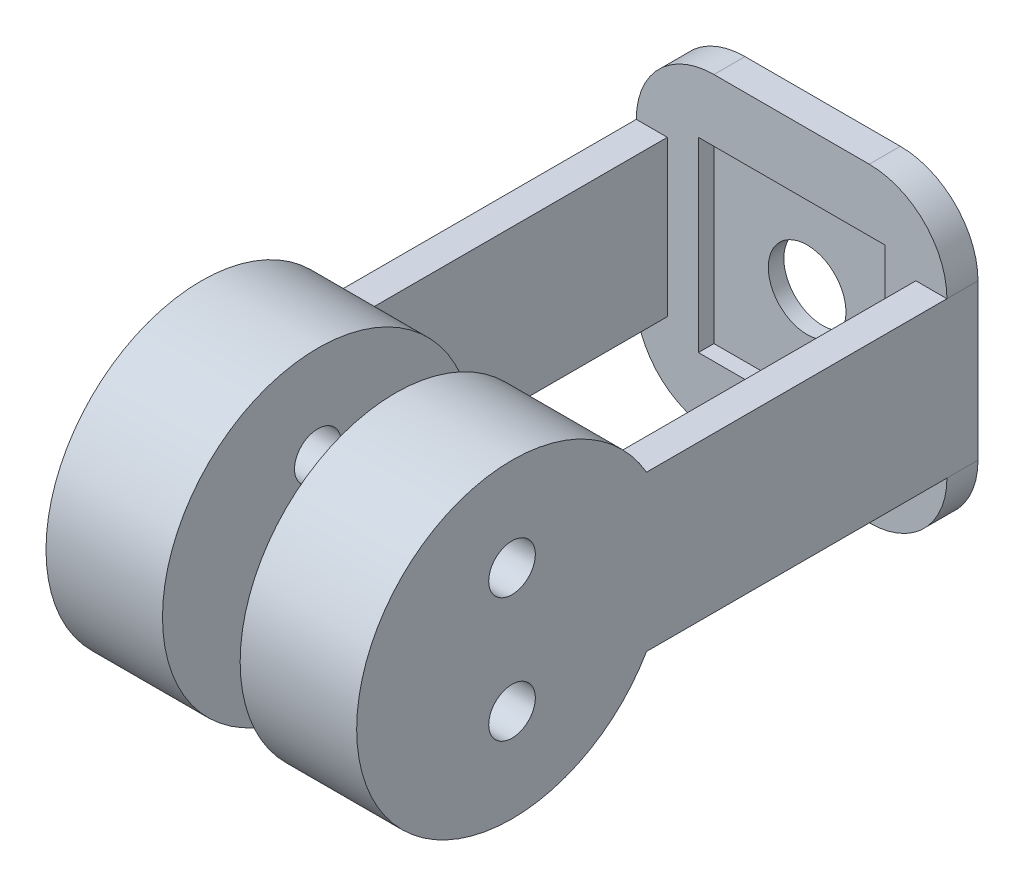
ISO-10303-21;
HEADER;
FILE_DESCRIPTION(('STEP AP214'),'2;1');
FILE_NAME('part.step','',(''),(''),'','','');
FILE_SCHEMA(('AUTOMOTIVE_DESIGN { 1 0 10303 214 1 1 1 1 }'));
ENDSEC;
DATA;
#1=APPLICATION_CONTEXT('core data for automotive mechanical design processes');
#2=APPLICATION_PROTOCOL_DEFINITION('international standard','automotive_design',2000,#1);
#3=PRODUCT_CONTEXT('',#1,'mechanical');
#4=PRODUCT('Part','Part','',(#3));
#5=PRODUCT_RELATED_PRODUCT_CATEGORY('part','',(#4));
#6=PRODUCT_DEFINITION_FORMATION('','',#4);
#7=PRODUCT_DEFINITION_CONTEXT('part definition',#1,'design');
#8=PRODUCT_DEFINITION('design','',#6,#7);
#9=PRODUCT_DEFINITION_SHAPE('','',#8);
#10=(LENGTH_UNIT() NAMED_UNIT(*) SI_UNIT(.MILLI.,.METRE.));
#11=(NAMED_UNIT(*) PLANE_ANGLE_UNIT() SI_UNIT($,.RADIAN.));
#12=(NAMED_UNIT(*) SI_UNIT($,.STERADIAN.) SOLID_ANGLE_UNIT());
#13=UNCERTAINTY_MEASURE_WITH_UNIT(LENGTH_MEASURE(1.E-05),#10,'distance_accuracy_value','');
#14=(GEOMETRIC_REPRESENTATION_CONTEXT(3) GLOBAL_UNCERTAINTY_ASSIGNED_CONTEXT((#13)) GLOBAL_UNIT_ASSIGNED_CONTEXT((#10,
#11,#12)) REPRESENTATION_CONTEXT('',''));
#15=CARTESIAN_POINT('',(0.,0.,0.));
#16=DIRECTION('',(0.,0.,1.));
#17=DIRECTION('',(1.,0.,0.));
#18=AXIS2_PLACEMENT_3D('',#15,#16,#17);
#19=CARTESIAN_POINT('',(-5.,-5.,2.));
#20=DIRECTION('',(0.,0.,-1.));
#21=DIRECTION('',(-1.,0.,0.));
#22=AXIS2_PLACEMENT_3D('',#19,#20,#21);
#23=CYLINDRICAL_SURFACE('',#22,5.);
#24=DIRECTION('',(0.,0.,-1.));
#25=VECTOR('',#24,1.);
#26=CARTESIAN_POINT('',(-5.,-10.,2.));
#27=LINE('',#26,#25);
#28=CARTESIAN_POINT('',(-5.,-10.,2.));
#29=VERTEX_POINT('',#28);
#30=CARTESIAN_POINT('',(-5.,-10.,0.));
#31=VERTEX_POINT('',#30);
#32=EDGE_CURVE('E180',#29,#31,#27,.T.);
#33=ORIENTED_EDGE('',*,*,#32,.F.);
#34=CARTESIAN_POINT('',(-5.,-5.,2.));
#35=DIRECTION('',(0.,0.,1.));
#36=DIRECTION('',(1.,0.,0.));
#37=AXIS2_PLACEMENT_3D('',#34,#35,#36);
#38=CIRCLE('',#37,5.);
#39=CARTESIAN_POINT('',(-10.,-5.,2.));
#40=VERTEX_POINT('',#39);
#41=EDGE_CURVE('E63',#40,#29,#38,.T.);
#42=ORIENTED_EDGE('',*,*,#41,.F.);
#43=DIRECTION('',(0.,0.,-1.));
#44=VECTOR('',#43,1.);
#45=CARTESIAN_POINT('',(-10.,-5.,2.));
#46=LINE('',#45,#44);
#47=CARTESIAN_POINT('',(-10.,-5.,0.));
#48=VERTEX_POINT('',#47);
#49=EDGE_CURVE('E177',#48,#40,#46,.F.);
#50=ORIENTED_EDGE('',*,*,#49,.F.);
#51=CARTESIAN_POINT('',(-5.,-5.,0.));
#52=DIRECTION('',(0.,0.,1.));
#53=DIRECTION('',(1.,0.,0.));
#54=AXIS2_PLACEMENT_3D('',#51,#52,#53);
#55=CIRCLE('',#54,5.);
#56=EDGE_CURVE('E12',#31,#48,#55,.F.);
#57=ORIENTED_EDGE('',*,*,#56,.F.);
#58=EDGE_LOOP('',(#33,#42,#50,#57));
#59=FACE_BOUND('',#58,.T.);
#60=ADVANCED_FACE('F56',(#59),#23,.T.);
#61=CARTESIAN_POINT('',(5.,-5.,2.));
#62=DIRECTION('',(0.,0.,-1.));
#63=DIRECTION('',(-1.,0.,0.));
#64=AXIS2_PLACEMENT_3D('',#61,#62,#63);
#65=CYLINDRICAL_SURFACE('',#64,5.);
#66=DIRECTION('',(0.,0.,-1.));
#67=VECTOR('',#66,1.);
#68=CARTESIAN_POINT('',(10.,-5.,2.));
#69=LINE('',#68,#67);
#70=CARTESIAN_POINT('',(10.,-5.,2.));
#71=VERTEX_POINT('',#70);
#72=CARTESIAN_POINT('',(10.,-5.,0.));
#73=VERTEX_POINT('',#72);
#74=EDGE_CURVE('E347',#71,#73,#69,.T.);
#75=ORIENTED_EDGE('',*,*,#74,.F.);
#76=CARTESIAN_POINT('',(5.,-5.,2.));
#77=DIRECTION('',(0.,0.,1.));
#78=DIRECTION('',(1.,0.,0.));
#79=AXIS2_PLACEMENT_3D('',#76,#77,#78);
#80=CIRCLE('',#79,5.);
#81=CARTESIAN_POINT('',(5.,-10.,2.));
#82=VERTEX_POINT('',#81);
#83=EDGE_CURVE('E353',#82,#71,#80,.T.);
#84=ORIENTED_EDGE('',*,*,#83,.F.);
#85=DIRECTION('',(0.,0.,-1.));
#86=VECTOR('',#85,1.);
#87=CARTESIAN_POINT('',(5.,-10.,2.));
#88=LINE('',#87,#86);
#89=CARTESIAN_POINT('',(5.,-10.,0.));
#90=VERTEX_POINT('',#89);
#91=EDGE_CURVE('E350',#90,#82,#88,.F.);
#92=ORIENTED_EDGE('',*,*,#91,.F.);
#93=CARTESIAN_POINT('',(5.,-5.,0.));
#94=DIRECTION('',(0.,0.,1.));
#95=DIRECTION('',(1.,0.,0.));
#96=AXIS2_PLACEMENT_3D('',#93,#94,#95);
#97=CIRCLE('',#96,5.);
#98=EDGE_CURVE('E355',#73,#90,#97,.F.);
#99=ORIENTED_EDGE('',*,*,#98,.F.);
#100=EDGE_LOOP('',(#75,#84,#92,#99));
#101=FACE_BOUND('',#100,.T.);
#102=ADVANCED_FACE('F366',(#101),#65,.T.);
#103=CARTESIAN_POINT('',(5.,5.,2.));
#104=DIRECTION('',(0.,0.,1.));
#105=DIRECTION('',(1.,0.,0.));
#106=AXIS2_PLACEMENT_3D('',#103,#104,#105);
#107=CYLINDRICAL_SURFACE('',#106,5.);
#108=DIRECTION('',(0.,0.,1.));
#109=VECTOR('',#108,1.);
#110=CARTESIAN_POINT('',(10.,5.,2.));
#111=LINE('',#110,#109);
#112=CARTESIAN_POINT('',(10.,5.,0.));
#113=VERTEX_POINT('',#112);
#114=CARTESIAN_POINT('',(10.,5.,2.));
#115=VERTEX_POINT('',#114);
#116=EDGE_CURVE('E336',#113,#115,#111,.T.);
#117=ORIENTED_EDGE('',*,*,#116,.F.);
#118=CARTESIAN_POINT('',(5.,5.,0.));
#119=DIRECTION('',(0.,0.,1.));
#120=DIRECTION('',(1.,0.,0.));
#121=AXIS2_PLACEMENT_3D('',#118,#119,#120);
#122=CIRCLE('',#121,5.);
#123=CARTESIAN_POINT('',(5.,10.,0.));
#124=VERTEX_POINT('',#123);
#125=EDGE_CURVE('E342',#124,#113,#122,.F.);
#126=ORIENTED_EDGE('',*,*,#125,.F.);
#127=DIRECTION('',(0.,0.,1.));
#128=VECTOR('',#127,1.);
#129=CARTESIAN_POINT('',(5.,10.,2.));
#130=LINE('',#129,#128);
#131=CARTESIAN_POINT('',(5.,10.,2.));
#132=VERTEX_POINT('',#131);
#133=EDGE_CURVE('E339',#132,#124,#130,.F.);
#134=ORIENTED_EDGE('',*,*,#133,.F.);
#135=CARTESIAN_POINT('',(5.,5.,2.));
#136=DIRECTION('',(0.,0.,1.));
#137=DIRECTION('',(1.,0.,0.));
#138=AXIS2_PLACEMENT_3D('',#135,#136,#137);
#139=CIRCLE('',#138,5.);
#140=EDGE_CURVE('E345',#115,#132,#139,.T.);
#141=ORIENTED_EDGE('',*,*,#140,.F.);
#142=EDGE_LOOP('',(#117,#126,#134,#141));
#143=FACE_BOUND('',#142,.T.);
#144=ADVANCED_FACE('F392',(#143),#107,.T.);
#145=CARTESIAN_POINT('',(-5.,5.,2.));
#146=DIRECTION('',(0.,0.,-1.));
#147=DIRECTION('',(-1.,0.,0.));
#148=AXIS2_PLACEMENT_3D('',#145,#146,#147);
#149=CYLINDRICAL_SURFACE('',#148,5.);
#150=DIRECTION('',(0.,0.,-1.));
#151=VECTOR('',#150,1.);
#152=CARTESIAN_POINT('',(-10.,5.,2.));
#153=LINE('',#152,#151);
#154=CARTESIAN_POINT('',(-10.,5.,2.));
#155=VERTEX_POINT('',#154);
#156=CARTESIAN_POINT('',(-10.,5.,0.));
#157=VERTEX_POINT('',#156);
#158=EDGE_CURVE('E315',#155,#157,#153,.T.);
#159=ORIENTED_EDGE('',*,*,#158,.F.);
#160=CARTESIAN_POINT('',(-5.,5.,2.));
#161=DIRECTION('',(0.,0.,1.));
#162=DIRECTION('',(1.,0.,0.));
#163=AXIS2_PLACEMENT_3D('',#160,#161,#162);
#164=CIRCLE('',#163,5.);
#165=CARTESIAN_POINT('',(-5.,10.,2.));
#166=VERTEX_POINT('',#165);
#167=EDGE_CURVE('E331',#166,#155,#164,.T.);
#168=ORIENTED_EDGE('',*,*,#167,.F.);
#169=DIRECTION('',(0.,0.,-1.));
#170=VECTOR('',#169,1.);
#171=CARTESIAN_POINT('',(-5.,10.,2.));
#172=LINE('',#171,#170);
#173=CARTESIAN_POINT('',(-5.,10.,0.));
#174=VERTEX_POINT('',#173);
#175=EDGE_CURVE('E328',#174,#166,#172,.F.);
#176=ORIENTED_EDGE('',*,*,#175,.F.);
#177=CARTESIAN_POINT('',(-5.,5.,0.));
#178=DIRECTION('',(0.,0.,1.));
#179=DIRECTION('',(1.,0.,0.));
#180=AXIS2_PLACEMENT_3D('',#177,#178,#179);
#181=CIRCLE('',#180,5.);
#182=EDGE_CURVE('E333',#157,#174,#181,.F.);
#183=ORIENTED_EDGE('',*,*,#182,.F.);
#184=EDGE_LOOP('',(#159,#168,#176,#183));
#185=FACE_BOUND('',#184,.T.);
#186=ADVANCED_FACE('F399',(#185),#149,.T.);
#187=CARTESIAN_POINT('',(10.,10.,2.));
#188=DIRECTION('',(-1.,0.,0.));
#189=DIRECTION('',(0.,0.,1.));
#190=AXIS2_PLACEMENT_3D('',#187,#188,#189);
#191=PLANE('',#190);
#192=CARTESIAN_POINT('',(10.,4.,30.));
#193=DIRECTION('',(-1.,0.,0.));
#194=DIRECTION('',(0.,0.,1.));
#195=AXIS2_PLACEMENT_3D('',#192,#193,#194);
#196=CIRCLE('',#195,1.5);
#197=CARTESIAN_POINT('',(10.,4.,31.5));
#198=VERTEX_POINT('',#197);
#199=EDGE_CURVE('E234',#198,#198,#196,.T.);
#200=ORIENTED_EDGE('',*,*,#199,.T.);
#201=EDGE_LOOP('',(#200));
#202=FACE_BOUND('',#201,.T.);
#203=CARTESIAN_POINT('',(10.,-4.,30.));
#204=DIRECTION('',(-1.,0.,0.));
#205=DIRECTION('',(0.,0.,1.));
#206=AXIS2_PLACEMENT_3D('',#203,#204,#205);
#207=CIRCLE('',#206,1.5);
#208=CARTESIAN_POINT('',(10.,-4.,31.5));
#209=VERTEX_POINT('',#208);
#210=EDGE_CURVE('E241',#209,#209,#207,.T.);
#211=ORIENTED_EDGE('',*,*,#210,.T.);
#212=EDGE_LOOP('',(#211));
#213=FACE_BOUND('',#212,.T.);
#214=DIRECTION('',(0.,0.,1.));
#215=VECTOR('',#214,1.);
#216=CARTESIAN_POINT('',(10.,-5.,0.));
#217=LINE('',#216,#215);
#218=CARTESIAN_POINT('',(10.,-5.,21.3397459621556));
#219=VERTEX_POINT('',#218);
#220=EDGE_CURVE('E205',#71,#219,#217,.T.);
#221=ORIENTED_EDGE('',*,*,#220,.F.);
#222=ORIENTED_EDGE('',*,*,#74,.T.);
#223=DIRECTION('',(0.,1.,0.));
#224=VECTOR('',#223,1.);
#225=CARTESIAN_POINT('',(10.,10.,0.));
#226=LINE('',#225,#224);
#227=EDGE_CURVE('E309',#73,#113,#226,.T.);
#228=ORIENTED_EDGE('',*,*,#227,.T.);
#229=ORIENTED_EDGE('',*,*,#116,.T.);
#230=DIRECTION('',(0.,0.,1.));
#231=VECTOR('',#230,1.);
#232=CARTESIAN_POINT('',(10.,5.,0.));
#233=LINE('',#232,#231);
#234=CARTESIAN_POINT('',(10.,5.,21.3397459621556));
#235=VERTEX_POINT('',#234);
#236=EDGE_CURVE('E218',#115,#235,#233,.T.);
#237=ORIENTED_EDGE('',*,*,#236,.T.);
#238=CARTESIAN_POINT('',(10.,0.,30.));
#239=DIRECTION('',(-1.,0.,0.));
#240=DIRECTION('',(0.,0.,1.));
#241=AXIS2_PLACEMENT_3D('',#238,#239,#240);
#242=CIRCLE('',#241,10.);
#243=EDGE_CURVE('E266',#219,#235,#242,.T.);
#244=ORIENTED_EDGE('',*,*,#243,.F.);
#245=EDGE_LOOP('',(#221,#222,#228,#229,#237,#244));
#246=FACE_BOUND('',#245,.T.);
#247=ADVANCED_FACE('F386',(#202,#213,#246),#191,.F.);
#248=CARTESIAN_POINT('',(-10.,10.,2.));
#249=DIRECTION('',(1.,0.,0.));
#250=DIRECTION('',(0.,0.,-1.));
#251=AXIS2_PLACEMENT_3D('',#248,#249,#250);
#252=PLANE('',#251);
#253=CARTESIAN_POINT('',(-10.,4.,30.));
#254=DIRECTION('',(-1.,0.,0.));
#255=DIRECTION('',(0.,0.,1.));
#256=AXIS2_PLACEMENT_3D('',#253,#254,#255);
#257=CIRCLE('',#256,1.5);
#258=CARTESIAN_POINT('',(-10.,4.,31.5));
#259=VERTEX_POINT('',#258);
#260=EDGE_CURVE('E238',#259,#259,#257,.T.);
#261=ORIENTED_EDGE('',*,*,#260,.F.);
#262=EDGE_LOOP('',(#261));
#263=FACE_BOUND('',#262,.T.);
#264=CARTESIAN_POINT('',(-10.,-4.,30.));
#265=DIRECTION('',(-1.,0.,0.));
#266=DIRECTION('',(0.,0.,1.));
#267=AXIS2_PLACEMENT_3D('',#264,#265,#266);
#268=CIRCLE('',#267,1.5);
#269=CARTESIAN_POINT('',(-10.,-4.,31.5));
#270=VERTEX_POINT('',#269);
#271=EDGE_CURVE('E233',#270,#270,#268,.T.);
#272=ORIENTED_EDGE('',*,*,#271,.F.);
#273=EDGE_LOOP('',(#272));
#274=FACE_BOUND('',#273,.T.);
#275=DIRECTION('',(0.,-1.,0.));
#276=VECTOR('',#275,1.);
#277=CARTESIAN_POINT('',(-10.,10.,0.));
#278=LINE('',#277,#276);
#279=EDGE_CURVE('E188',#157,#48,#278,.T.);
#280=ORIENTED_EDGE('',*,*,#279,.T.);
#281=ORIENTED_EDGE('',*,*,#49,.T.);
#282=DIRECTION('',(0.,0.,1.));
#283=VECTOR('',#282,1.);
#284=CARTESIAN_POINT('',(-10.,-5.,0.));
#285=LINE('',#284,#283);
#286=CARTESIAN_POINT('',(-10.,-5.,21.3397459621556));
#287=VERTEX_POINT('',#286);
#288=EDGE_CURVE('E186',#40,#287,#285,.T.);
#289=ORIENTED_EDGE('',*,*,#288,.T.);
#290=CARTESIAN_POINT('',(-10.,0.,30.));
#291=DIRECTION('',(-1.,0.,0.));
#292=DIRECTION('',(0.,0.,1.));
#293=AXIS2_PLACEMENT_3D('',#290,#291,#292);
#294=CIRCLE('',#293,10.);
#295=CARTESIAN_POINT('',(-10.,5.,21.3397459621556));
#296=VERTEX_POINT('',#295);
#297=EDGE_CURVE('E265',#287,#296,#294,.T.);
#298=ORIENTED_EDGE('',*,*,#297,.T.);
#299=DIRECTION('',(0.,0.,1.));
#300=VECTOR('',#299,1.);
#301=CARTESIAN_POINT('',(-10.,5.,0.));
#302=LINE('',#301,#300);
#303=EDGE_CURVE('E214',#155,#296,#302,.T.);
#304=ORIENTED_EDGE('',*,*,#303,.F.);
#305=ORIENTED_EDGE('',*,*,#158,.T.);
#306=EDGE_LOOP('',(#280,#281,#289,#298,#304,#305));
#307=FACE_BOUND('',#306,.T.);
#308=ADVANCED_FACE('F184',(#263,#274,#307),#252,.F.);
#309=CARTESIAN_POINT('',(8.,10.,40.));
#310=DIRECTION('',(1.,0.,0.));
#311=DIRECTION('',(0.,1.,0.));
#312=AXIS2_PLACEMENT_3D('',#309,#310,#311);
#313=PLANE('',#312);
#314=DIRECTION('',(0.,-1.,0.));
#315=VECTOR('',#314,1.);
#316=CARTESIAN_POINT('',(8.,10.,2.));
#317=LINE('',#316,#315);
#318=CARTESIAN_POINT('',(8.,5.,2.));
#319=VERTEX_POINT('',#318);
#320=CARTESIAN_POINT('',(8.,-5.,2.));
#321=VERTEX_POINT('',#320);
#322=EDGE_CURVE('E270',#319,#321,#317,.T.);
#323=ORIENTED_EDGE('',*,*,#322,.T.);
#324=DIRECTION('',(0.,0.,1.));
#325=VECTOR('',#324,1.);
#326=CARTESIAN_POINT('',(8.,-5.,40.));
#327=LINE('',#326,#325);
#328=CARTESIAN_POINT('',(8.,-5.,21.3397459621556));
#329=VERTEX_POINT('',#328);
#330=EDGE_CURVE('E230',#321,#329,#327,.T.);
#331=ORIENTED_EDGE('',*,*,#330,.T.);
#332=CARTESIAN_POINT('',(8.,0.,29.9999999999999));
#333=DIRECTION('',(1.,0.,0.));
#334=DIRECTION('',(0.,1.,0.));
#335=AXIS2_PLACEMENT_3D('',#332,#333,#334);
#336=CIRCLE('',#335,10.);
#337=CARTESIAN_POINT('',(8.,5.,21.3397459621556));
#338=VERTEX_POINT('',#337);
#339=EDGE_CURVE('E256',#329,#338,#336,.T.);
#340=ORIENTED_EDGE('',*,*,#339,.T.);
#341=DIRECTION('',(0.,0.,1.));
#342=VECTOR('',#341,1.);
#343=CARTESIAN_POINT('',(8.,5.,40.));
#344=LINE('',#343,#342);
#345=EDGE_CURVE('E226',#319,#338,#344,.T.);
#346=ORIENTED_EDGE('',*,*,#345,.F.);
#347=EDGE_LOOP('',(#323,#331,#340,#346));
#348=FACE_BOUND('',#347,.T.);
#349=ADVANCED_FACE('F374',(#348),#313,.F.);
#350=CARTESIAN_POINT('',(-8.,10.,40.));
#351=DIRECTION('',(-1.,0.,0.));
#352=DIRECTION('',(0.,-1.,0.));
#353=AXIS2_PLACEMENT_3D('',#350,#351,#352);
#354=PLANE('',#353);
#355=CARTESIAN_POINT('',(-8.,0.,30.));
#356=DIRECTION('',(-1.,0.,0.));
#357=DIRECTION('',(0.,-1.,0.));
#358=AXIS2_PLACEMENT_3D('',#355,#356,#357);
#359=CIRCLE('',#358,10.);
#360=CARTESIAN_POINT('',(-8.,5.,21.3397459621556));
#361=VERTEX_POINT('',#360);
#362=CARTESIAN_POINT('',(-8.,-5.,21.3397459621556));
#363=VERTEX_POINT('',#362);
#364=EDGE_CURVE('E262',#361,#363,#359,.T.);
#365=ORIENTED_EDGE('',*,*,#364,.T.);
#366=DIRECTION('',(0.,0.,-1.));
#367=VECTOR('',#366,1.);
#368=CARTESIAN_POINT('',(-8.,-5.,40.));
#369=LINE('',#368,#367);
#370=CARTESIAN_POINT('',(-8.,-5.,2.));
#371=VERTEX_POINT('',#370);
#372=EDGE_CURVE('E228',#363,#371,#369,.T.);
#373=ORIENTED_EDGE('',*,*,#372,.T.);
#374=DIRECTION('',(0.,1.,0.));
#375=VECTOR('',#374,1.);
#376=CARTESIAN_POINT('',(-8.,10.,2.));
#377=LINE('',#376,#375);
#378=CARTESIAN_POINT('',(-8.,5.,2.));
#379=VERTEX_POINT('',#378);
#380=EDGE_CURVE('E195',#371,#379,#377,.T.);
#381=ORIENTED_EDGE('',*,*,#380,.T.);
#382=DIRECTION('',(0.,0.,-1.));
#383=VECTOR('',#382,1.);
#384=CARTESIAN_POINT('',(-8.,5.,40.));
#385=LINE('',#384,#383);
#386=EDGE_CURVE('E212',#361,#379,#385,.T.);
#387=ORIENTED_EDGE('',*,*,#386,.F.);
#388=EDGE_LOOP('',(#365,#373,#381,#387));
#389=FACE_BOUND('',#388,.T.);
#390=ADVANCED_FACE('F405',(#389),#354,.F.);
#391=CARTESIAN_POINT('',(-10.,10.,2.));
#392=DIRECTION('',(0.,-1.,0.));
#393=DIRECTION('',(0.,0.,-1.));
#394=AXIS2_PLACEMENT_3D('',#391,#392,#393);
#395=PLANE('',#394);
#396=DIRECTION('',(-1.,0.,0.));
#397=VECTOR('',#396,1.);
#398=CARTESIAN_POINT('',(-10.,10.,2.));
#399=LINE('',#398,#397);
#400=EDGE_CURVE('E310',#132,#166,#399,.T.);
#401=ORIENTED_EDGE('',*,*,#400,.F.);
#402=ORIENTED_EDGE('',*,*,#133,.T.);
#403=DIRECTION('',(-1.,0.,0.));
#404=VECTOR('',#403,1.);
#405=CARTESIAN_POINT('',(-10.,10.,0.));
#406=LINE('',#405,#404);
#407=EDGE_CURVE('E317',#124,#174,#406,.T.);
#408=ORIENTED_EDGE('',*,*,#407,.T.);
#409=ORIENTED_EDGE('',*,*,#175,.T.);
#410=EDGE_LOOP('',(#401,#402,#408,#409));
#411=FACE_BOUND('',#410,.T.);
#412=ADVANCED_FACE('F395',(#411),#395,.F.);
#413=CARTESIAN_POINT('',(0.,0.,2.));
#414=DIRECTION('',(0.,0.,1.));
#415=DIRECTION('',(1.,0.,0.));
#416=AXIS2_PLACEMENT_3D('',#413,#414,#415);
#417=PLANE('',#416);
#418=DIRECTION('',(-1.,0.,0.));
#419=VECTOR('',#418,1.);
#420=CARTESIAN_POINT('',(-6.,6.,2.));
#421=LINE('',#420,#419);
#422=CARTESIAN_POINT('',(6.,6.,2.));
#423=VERTEX_POINT('',#422);
#424=CARTESIAN_POINT('',(-6.,6.,2.));
#425=VERTEX_POINT('',#424);
#426=EDGE_CURVE('E289',#423,#425,#421,.T.);
#427=ORIENTED_EDGE('',*,*,#426,.F.);
#428=DIRECTION('',(0.,1.,0.));
#429=VECTOR('',#428,1.);
#430=CARTESIAN_POINT('',(6.,6.,2.));
#431=LINE('',#430,#429);
#432=CARTESIAN_POINT('',(6.,-6.,2.));
#433=VERTEX_POINT('',#432);
#434=EDGE_CURVE('E273',#433,#423,#431,.T.);
#435=ORIENTED_EDGE('',*,*,#434,.F.);
#436=DIRECTION('',(1.,0.,0.));
#437=VECTOR('',#436,1.);
#438=CARTESIAN_POINT('',(-6.,-6.,2.));
#439=LINE('',#438,#437);
#440=CARTESIAN_POINT('',(-6.,-6.,2.));
#441=VERTEX_POINT('',#440);
#442=EDGE_CURVE('E278',#441,#433,#439,.T.);
#443=ORIENTED_EDGE('',*,*,#442,.F.);
#444=DIRECTION('',(0.,-1.,0.));
#445=VECTOR('',#444,1.);
#446=CARTESIAN_POINT('',(-6.,6.,2.));
#447=LINE('',#446,#445);
#448=EDGE_CURVE('E292',#425,#441,#447,.T.);
#449=ORIENTED_EDGE('',*,*,#448,.F.);
#450=EDGE_LOOP('',(#427,#435,#443,#449));
#451=FACE_BOUND('',#450,.T.);
#452=DIRECTION('',(1.,0.,0.));
#453=VECTOR('',#452,1.);
#454=CARTESIAN_POINT('',(-10.,-5.,2.));
#455=LINE('',#454,#453);
#456=EDGE_CURVE('E191',#40,#371,#455,.T.);
#457=ORIENTED_EDGE('',*,*,#456,.F.);
#458=ORIENTED_EDGE('',*,*,#41,.T.);
#459=DIRECTION('',(1.,0.,0.));
#460=VECTOR('',#459,1.);
#461=CARTESIAN_POINT('',(-10.,-10.,2.));
#462=LINE('',#461,#460);
#463=EDGE_CURVE('E312',#29,#82,#462,.T.);
#464=ORIENTED_EDGE('',*,*,#463,.T.);
#465=ORIENTED_EDGE('',*,*,#83,.T.);
#466=EDGE_CURVE('E199',#321,#71,#455,.T.);
#467=ORIENTED_EDGE('',*,*,#466,.F.);
#468=ORIENTED_EDGE('',*,*,#322,.F.);
#469=DIRECTION('',(1.,0.,0.));
#470=VECTOR('',#469,1.);
#471=CARTESIAN_POINT('',(-10.,5.,2.));
#472=LINE('',#471,#470);
#473=EDGE_CURVE('E222',#319,#115,#472,.T.);
#474=ORIENTED_EDGE('',*,*,#473,.T.);
#475=ORIENTED_EDGE('',*,*,#140,.T.);
#476=ORIENTED_EDGE('',*,*,#400,.T.);
#477=ORIENTED_EDGE('',*,*,#167,.T.);
#478=EDGE_CURVE('E209',#155,#379,#472,.T.);
#479=ORIENTED_EDGE('',*,*,#478,.T.);
#480=ORIENTED_EDGE('',*,*,#380,.F.);
#481=EDGE_LOOP('',(#457,#458,#464,#465,#467,#468,#474,#475,#476,#477,#479,#480));
#482=FACE_BOUND('',#481,.T.);
#483=ADVANCED_FACE('F192',(#451,#482),#417,.T.);
#484=CARTESIAN_POINT('',(0.,0.,2.));
#485=DIRECTION('',(0.,0.,-1.));
#486=DIRECTION('',(-1.,0.,0.));
#487=AXIS2_PLACEMENT_3D('',#484,#485,#486);
#488=CYLINDRICAL_SURFACE('',#487,2.5);
#489=CARTESIAN_POINT('',(0.,0.,0.));
#490=DIRECTION('',(0.,0.,-1.));
#491=DIRECTION('',(-1.,0.,0.));
#492=AXIS2_PLACEMENT_3D('',#489,#490,#491);
#493=CIRCLE('',#492,2.5);
#494=CARTESIAN_POINT('',(-2.5,0.,0.));
#495=VERTEX_POINT('',#494);
#496=EDGE_CURVE('E306',#495,#495,#493,.T.);
#497=ORIENTED_EDGE('',*,*,#496,.T.);
#498=EDGE_LOOP('',(#497));
#499=FACE_BOUND('',#498,.T.);
#500=CARTESIAN_POINT('',(0.,0.,1.));
#501=DIRECTION('',(0.,0.,1.));
#502=DIRECTION('',(1.,0.,0.));
#503=AXIS2_PLACEMENT_3D('',#500,#501,#502);
#504=CIRCLE('',#503,2.5);
#505=CARTESIAN_POINT('',(2.5,0.,1.));
#506=VERTEX_POINT('',#505);
#507=EDGE_CURVE('E298',#506,#506,#504,.F.);
#508=ORIENTED_EDGE('',*,*,#507,.F.);
#509=EDGE_LOOP('',(#508));
#510=FACE_BOUND('',#509,.T.);
#511=ADVANCED_FACE('F444',(#499,#510),#488,.F.);
#512=CARTESIAN_POINT('',(-10.,-10.,2.));
#513=DIRECTION('',(0.,1.,0.));
#514=DIRECTION('',(0.,0.,1.));
#515=AXIS2_PLACEMENT_3D('',#512,#513,#514);
#516=PLANE('',#515);
#517=ORIENTED_EDGE('',*,*,#463,.F.);
#518=ORIENTED_EDGE('',*,*,#32,.T.);
#519=DIRECTION('',(1.,0.,0.));
#520=VECTOR('',#519,1.);
#521=CARTESIAN_POINT('',(-10.,-10.,0.));
#522=LINE('',#521,#520);
#523=EDGE_CURVE('E313',#31,#90,#522,.T.);
#524=ORIENTED_EDGE('',*,*,#523,.T.);
#525=ORIENTED_EDGE('',*,*,#91,.T.);
#526=EDGE_LOOP('',(#517,#518,#524,#525));
#527=FACE_BOUND('',#526,.T.);
#528=ADVANCED_FACE('F359',(#527),#516,.F.);
#529=CARTESIAN_POINT('',(0.,0.,0.));
#530=DIRECTION('',(0.,0.,1.));
#531=DIRECTION('',(1.,0.,0.));
#532=AXIS2_PLACEMENT_3D('',#529,#530,#531);
#533=PLANE('',#532);
#534=ORIENTED_EDGE('',*,*,#496,.F.);
#535=EDGE_LOOP('',(#534));
#536=FACE_BOUND('',#535,.T.);
#537=ORIENTED_EDGE('',*,*,#523,.F.);
#538=ORIENTED_EDGE('',*,*,#56,.T.);
#539=ORIENTED_EDGE('',*,*,#279,.F.);
#540=ORIENTED_EDGE('',*,*,#182,.T.);
#541=ORIENTED_EDGE('',*,*,#407,.F.);
#542=ORIENTED_EDGE('',*,*,#125,.T.);
#543=ORIENTED_EDGE('',*,*,#227,.F.);
#544=ORIENTED_EDGE('',*,*,#98,.T.);
#545=EDGE_LOOP('',(#537,#538,#539,#540,#541,#542,#543,#544));
#546=FACE_BOUND('',#545,.T.);
#547=ADVANCED_FACE('F360',(#536,#546),#533,.F.);
#548=CARTESIAN_POINT('',(0.,0.,1.));
#549=DIRECTION('',(0.,0.,1.));
#550=DIRECTION('',(1.,0.,0.));
#551=AXIS2_PLACEMENT_3D('',#548,#549,#550);
#552=PLANE('',#551);
#553=DIRECTION('',(0.,1.,0.));
#554=VECTOR('',#553,1.);
#555=CARTESIAN_POINT('',(6.,6.,1.));
#556=LINE('',#555,#554);
#557=CARTESIAN_POINT('',(6.,-6.,1.));
#558=VERTEX_POINT('',#557);
#559=CARTESIAN_POINT('',(6.,6.,1.));
#560=VERTEX_POINT('',#559);
#561=EDGE_CURVE('E274',#558,#560,#556,.T.);
#562=ORIENTED_EDGE('',*,*,#561,.T.);
#563=DIRECTION('',(-1.,0.,0.));
#564=VECTOR('',#563,1.);
#565=CARTESIAN_POINT('',(-6.,6.,1.));
#566=LINE('',#565,#564);
#567=CARTESIAN_POINT('',(-6.,6.,1.));
#568=VERTEX_POINT('',#567);
#569=EDGE_CURVE('E277',#560,#568,#566,.T.);
#570=ORIENTED_EDGE('',*,*,#569,.T.);
#571=DIRECTION('',(0.,-1.,0.));
#572=VECTOR('',#571,1.);
#573=CARTESIAN_POINT('',(-6.,6.,1.));
#574=LINE('',#573,#572);
#575=CARTESIAN_POINT('',(-6.,-6.,1.));
#576=VERTEX_POINT('',#575);
#577=EDGE_CURVE('E281',#568,#576,#574,.T.);
#578=ORIENTED_EDGE('',*,*,#577,.T.);
#579=DIRECTION('',(1.,0.,0.));
#580=VECTOR('',#579,1.);
#581=CARTESIAN_POINT('',(-6.,-6.,1.));
#582=LINE('',#581,#580);
#583=EDGE_CURVE('E284',#576,#558,#582,.T.);
#584=ORIENTED_EDGE('',*,*,#583,.T.);
#585=EDGE_LOOP('',(#562,#570,#578,#584));
#586=FACE_BOUND('',#585,.T.);
#587=ORIENTED_EDGE('',*,*,#507,.T.);
#588=EDGE_LOOP('',(#587));
#589=FACE_BOUND('',#588,.T.);
#590=ADVANCED_FACE('F447',(#586,#589),#552,.T.);
#591=CARTESIAN_POINT('',(6.,6.,1.));
#592=DIRECTION('',(1.,0.,0.));
#593=DIRECTION('',(0.,1.,0.));
#594=AXIS2_PLACEMENT_3D('',#591,#592,#593);
#595=PLANE('',#594);
#596=ORIENTED_EDGE('',*,*,#434,.T.);
#597=DIRECTION('',(0.,0.,1.));
#598=VECTOR('',#597,1.);
#599=CARTESIAN_POINT('',(6.,6.,1.));
#600=LINE('',#599,#598);
#601=EDGE_CURVE('E287',#560,#423,#600,.T.);
#602=ORIENTED_EDGE('',*,*,#601,.F.);
#603=ORIENTED_EDGE('',*,*,#561,.F.);
#604=DIRECTION('',(0.,0.,1.));
#605=VECTOR('',#604,1.);
#606=CARTESIAN_POINT('',(6.,-6.,1.));
#607=LINE('',#606,#605);
#608=EDGE_CURVE('E296',#558,#433,#607,.T.);
#609=ORIENTED_EDGE('',*,*,#608,.T.);
#610=EDGE_LOOP('',(#596,#602,#603,#609));
#611=FACE_BOUND('',#610,.T.);
#612=ADVANCED_FACE('F455',(#611),#595,.F.);
#613=CARTESIAN_POINT('',(-6.,-6.,1.));
#614=DIRECTION('',(0.,-1.,0.));
#615=DIRECTION('',(0.,0.,-1.));
#616=AXIS2_PLACEMENT_3D('',#613,#614,#615);
#617=PLANE('',#616);
#618=ORIENTED_EDGE('',*,*,#442,.T.);
#619=ORIENTED_EDGE('',*,*,#608,.F.);
#620=ORIENTED_EDGE('',*,*,#583,.F.);
#621=DIRECTION('',(0.,0.,1.));
#622=VECTOR('',#621,1.);
#623=CARTESIAN_POINT('',(-6.,-6.,1.));
#624=LINE('',#623,#622);
#625=EDGE_CURVE('E299',#576,#441,#624,.T.);
#626=ORIENTED_EDGE('',*,*,#625,.T.);
#627=EDGE_LOOP('',(#618,#619,#620,#626));
#628=FACE_BOUND('',#627,.T.);
#629=ADVANCED_FACE('F458',(#628),#617,.F.);
#630=CARTESIAN_POINT('',(-6.,6.,1.));
#631=DIRECTION('',(-1.,0.,0.));
#632=DIRECTION('',(0.,-1.,0.));
#633=AXIS2_PLACEMENT_3D('',#630,#631,#632);
#634=PLANE('',#633);
#635=ORIENTED_EDGE('',*,*,#448,.T.);
#636=ORIENTED_EDGE('',*,*,#625,.F.);
#637=ORIENTED_EDGE('',*,*,#577,.F.);
#638=DIRECTION('',(0.,0.,1.));
#639=VECTOR('',#638,1.);
#640=CARTESIAN_POINT('',(-6.,6.,1.));
#641=LINE('',#640,#639);
#642=EDGE_CURVE('E302',#568,#425,#641,.T.);
#643=ORIENTED_EDGE('',*,*,#642,.T.);
#644=EDGE_LOOP('',(#635,#636,#637,#643));
#645=FACE_BOUND('',#644,.T.);
#646=ADVANCED_FACE('F463',(#645),#634,.F.);
#647=CARTESIAN_POINT('',(-6.,6.,1.));
#648=DIRECTION('',(0.,1.,0.));
#649=DIRECTION('',(0.,0.,1.));
#650=AXIS2_PLACEMENT_3D('',#647,#648,#649);
#651=PLANE('',#650);
#652=ORIENTED_EDGE('',*,*,#426,.T.);
#653=ORIENTED_EDGE('',*,*,#642,.F.);
#654=ORIENTED_EDGE('',*,*,#569,.F.);
#655=ORIENTED_EDGE('',*,*,#601,.T.);
#656=EDGE_LOOP('',(#652,#653,#654,#655));
#657=FACE_BOUND('',#656,.T.);
#658=ADVANCED_FACE('F460',(#657),#651,.F.);
#659=CARTESIAN_POINT('',(10.,0.,30.));
#660=DIRECTION('',(-1.,0.,0.));
#661=DIRECTION('',(0.,0.,1.));
#662=AXIS2_PLACEMENT_3D('',#659,#660,#661);
#663=CYLINDRICAL_SURFACE('',#662,10.);
#664=ORIENTED_EDGE('',*,*,#364,.F.);
#665=DIRECTION('',(1.,0.,0.));
#666=VECTOR('',#665,1.);
#667=CARTESIAN_POINT('',(-10.,5.,21.3397459621556));
#668=LINE('',#667,#666);
#669=EDGE_CURVE('E223',#296,#361,#668,.T.);
#670=ORIENTED_EDGE('',*,*,#669,.F.);
#671=ORIENTED_EDGE('',*,*,#297,.F.);
#672=DIRECTION('',(1.,0.,0.));
#673=VECTOR('',#672,1.);
#674=CARTESIAN_POINT('',(-10.,-5.,21.3397459621556));
#675=LINE('',#674,#673);
#676=EDGE_CURVE('E204',#287,#363,#675,.T.);
#677=ORIENTED_EDGE('',*,*,#676,.T.);
#678=EDGE_LOOP('',(#664,#670,#671,#677));
#679=FACE_BOUND('',#678,.T.);
#680=CARTESIAN_POINT('',(-2.5,0.,30.));
#681=DIRECTION('',(-1.,0.,0.));
#682=DIRECTION('',(0.,0.,1.));
#683=AXIS2_PLACEMENT_3D('',#680,#681,#682);
#684=CIRCLE('',#683,10.);
#685=CARTESIAN_POINT('',(-2.5,0.,40.));
#686=VERTEX_POINT('',#685);
#687=EDGE_CURVE('E259',#686,#686,#684,.T.);
#688=ORIENTED_EDGE('',*,*,#687,.T.);
#689=EDGE_LOOP('',(#688));
#690=FACE_BOUND('',#689,.T.);
#691=ADVANCED_FACE('F408',(#679,#690),#663,.T.);
#692=ORIENTED_EDGE('',*,*,#339,.F.);
#693=EDGE_CURVE('E198',#329,#219,#675,.T.);
#694=ORIENTED_EDGE('',*,*,#693,.T.);
#695=ORIENTED_EDGE('',*,*,#243,.T.);
#696=EDGE_CURVE('E217',#338,#235,#668,.T.);
#697=ORIENTED_EDGE('',*,*,#696,.F.);
#698=EDGE_LOOP('',(#692,#694,#695,#697));
#699=FACE_BOUND('',#698,.T.);
#700=CARTESIAN_POINT('',(2.5,0.,29.9999999999999));
#701=DIRECTION('',(1.,0.,0.));
#702=DIRECTION('',(0.,0.,-1.));
#703=AXIS2_PLACEMENT_3D('',#700,#701,#702);
#704=CIRCLE('',#703,10.);
#705=CARTESIAN_POINT('',(2.5,0.,19.9999999999999));
#706=VERTEX_POINT('',#705);
#707=EDGE_CURVE('E253',#706,#706,#704,.T.);
#708=ORIENTED_EDGE('',*,*,#707,.T.);
#709=EDGE_LOOP('',(#708));
#710=FACE_BOUND('',#709,.T.);
#711=ADVANCED_FACE('F382',(#699,#710),#663,.T.);
#712=CARTESIAN_POINT('',(-2.5,0.,30.));
#713=DIRECTION('',(-1.,0.,0.));
#714=DIRECTION('',(0.,0.,1.));
#715=AXIS2_PLACEMENT_3D('',#712,#713,#714);
#716=PLANE('',#715);
#717=CARTESIAN_POINT('',(-2.5,4.,30.));
#718=DIRECTION('',(-1.,0.,0.));
#719=DIRECTION('',(0.,0.,1.));
#720=AXIS2_PLACEMENT_3D('',#717,#718,#719);
#721=CIRCLE('',#720,1.5);
#722=CARTESIAN_POINT('',(-2.5,4.,31.5));
#723=VERTEX_POINT('',#722);
#724=EDGE_CURVE('E250',#723,#723,#721,.T.);
#725=ORIENTED_EDGE('',*,*,#724,.T.);
#726=EDGE_LOOP('',(#725));
#727=FACE_BOUND('',#726,.T.);
#728=CARTESIAN_POINT('',(-2.5,-4.,30.));
#729=DIRECTION('',(-1.,0.,0.));
#730=DIRECTION('',(0.,0.,1.));
#731=AXIS2_PLACEMENT_3D('',#728,#729,#730);
#732=CIRCLE('',#731,1.5);
#733=CARTESIAN_POINT('',(-2.5,-4.,31.5));
#734=VERTEX_POINT('',#733);
#735=EDGE_CURVE('E246',#734,#734,#732,.T.);
#736=ORIENTED_EDGE('',*,*,#735,.T.);
#737=EDGE_LOOP('',(#736));
#738=FACE_BOUND('',#737,.T.);
#739=ORIENTED_EDGE('',*,*,#687,.F.);
#740=EDGE_LOOP('',(#739));
#741=FACE_BOUND('',#740,.T.);
#742=ADVANCED_FACE('F480',(#727,#738,#741),#716,.F.);
#743=CARTESIAN_POINT('',(2.5,0.,29.9999999999999));
#744=DIRECTION('',(1.,0.,0.));
#745=DIRECTION('',(0.,0.,-1.));
#746=AXIS2_PLACEMENT_3D('',#743,#744,#745);
#747=PLANE('',#746);
#748=CARTESIAN_POINT('',(2.5,4.,30.));
#749=DIRECTION('',(1.,0.,0.));
#750=DIRECTION('',(0.,0.,-1.));
#751=AXIS2_PLACEMENT_3D('',#748,#749,#750);
#752=CIRCLE('',#751,1.5);
#753=CARTESIAN_POINT('',(2.5,4.,28.5));
#754=VERTEX_POINT('',#753);
#755=EDGE_CURVE('E249',#754,#754,#752,.T.);
#756=ORIENTED_EDGE('',*,*,#755,.T.);
#757=EDGE_LOOP('',(#756));
#758=FACE_BOUND('',#757,.T.);
#759=CARTESIAN_POINT('',(2.5,-4.,30.));
#760=DIRECTION('',(1.,0.,0.));
#761=DIRECTION('',(0.,0.,-1.));
#762=AXIS2_PLACEMENT_3D('',#759,#760,#761);
#763=CIRCLE('',#762,1.5);
#764=CARTESIAN_POINT('',(2.5,-4.,28.5));
#765=VERTEX_POINT('',#764);
#766=EDGE_CURVE('E237',#765,#765,#763,.T.);
#767=ORIENTED_EDGE('',*,*,#766,.T.);
#768=EDGE_LOOP('',(#767));
#769=FACE_BOUND('',#768,.T.);
#770=ORIENTED_EDGE('',*,*,#707,.F.);
#771=EDGE_LOOP('',(#770));
#772=FACE_BOUND('',#771,.T.);
#773=ADVANCED_FACE('F483',(#758,#769,#772),#747,.F.);
#774=CARTESIAN_POINT('',(10.,-4.,30.));
#775=DIRECTION('',(-1.,0.,0.));
#776=DIRECTION('',(0.,0.,1.));
#777=AXIS2_PLACEMENT_3D('',#774,#775,#776);
#778=CYLINDRICAL_SURFACE('',#777,1.5);
#779=ORIENTED_EDGE('',*,*,#210,.F.);
#780=EDGE_LOOP('',(#779));
#781=FACE_BOUND('',#780,.T.);
#782=ORIENTED_EDGE('',*,*,#766,.F.);
#783=EDGE_LOOP('',(#782));
#784=FACE_BOUND('',#783,.T.);
#785=ADVANCED_FACE('F487',(#781,#784),#778,.F.);
#786=CARTESIAN_POINT('',(10.,4.,30.));
#787=DIRECTION('',(-1.,0.,0.));
#788=DIRECTION('',(0.,0.,1.));
#789=AXIS2_PLACEMENT_3D('',#786,#787,#788);
#790=CYLINDRICAL_SURFACE('',#789,1.5);
#791=ORIENTED_EDGE('',*,*,#199,.F.);
#792=EDGE_LOOP('',(#791));
#793=FACE_BOUND('',#792,.T.);
#794=ORIENTED_EDGE('',*,*,#755,.F.);
#795=EDGE_LOOP('',(#794));
#796=FACE_BOUND('',#795,.T.);
#797=ADVANCED_FACE('F491',(#793,#796),#790,.F.);
#798=ORIENTED_EDGE('',*,*,#271,.T.);
#799=EDGE_LOOP('',(#798));
#800=FACE_BOUND('',#799,.T.);
#801=ORIENTED_EDGE('',*,*,#735,.F.);
#802=EDGE_LOOP('',(#801));
#803=FACE_BOUND('',#802,.T.);
#804=ADVANCED_FACE('F489',(#800,#803),#778,.F.);
#805=ORIENTED_EDGE('',*,*,#260,.T.);
#806=EDGE_LOOP('',(#805));
#807=FACE_BOUND('',#806,.T.);
#808=ORIENTED_EDGE('',*,*,#724,.F.);
#809=EDGE_LOOP('',(#808));
#810=FACE_BOUND('',#809,.T.);
#811=ADVANCED_FACE('F422',(#807,#810),#790,.F.);
#812=CARTESIAN_POINT('',(-10.,5.,0.));
#813=DIRECTION('',(0.,1.,0.));
#814=DIRECTION('',(0.,0.,1.));
#815=AXIS2_PLACEMENT_3D('',#812,#813,#814);
#816=PLANE('',#815);
#817=ORIENTED_EDGE('',*,*,#345,.T.);
#818=ORIENTED_EDGE('',*,*,#696,.T.);
#819=ORIENTED_EDGE('',*,*,#236,.F.);
#820=ORIENTED_EDGE('',*,*,#473,.F.);
#821=EDGE_LOOP('',(#817,#818,#819,#820));
#822=FACE_BOUND('',#821,.T.);
#823=ADVANCED_FACE('F379',(#822),#816,.T.);
#824=CARTESIAN_POINT('',(-10.,-5.,0.));
#825=DIRECTION('',(0.,1.,0.));
#826=DIRECTION('',(0.,0.,1.));
#827=AXIS2_PLACEMENT_3D('',#824,#825,#826);
#828=PLANE('',#827);
#829=ORIENTED_EDGE('',*,*,#466,.T.);
#830=ORIENTED_EDGE('',*,*,#220,.T.);
#831=ORIENTED_EDGE('',*,*,#693,.F.);
#832=ORIENTED_EDGE('',*,*,#330,.F.);
#833=EDGE_LOOP('',(#829,#830,#831,#832));
#834=FACE_BOUND('',#833,.T.);
#835=ADVANCED_FACE('F413',(#834),#828,.F.);
#836=ORIENTED_EDGE('',*,*,#386,.T.);
#837=ORIENTED_EDGE('',*,*,#478,.F.);
#838=ORIENTED_EDGE('',*,*,#303,.T.);
#839=ORIENTED_EDGE('',*,*,#669,.T.);
#840=EDGE_LOOP('',(#836,#837,#838,#839));
#841=FACE_BOUND('',#840,.T.);
#842=ADVANCED_FACE('F411',(#841),#816,.T.);
#843=ORIENTED_EDGE('',*,*,#676,.F.);
#844=ORIENTED_EDGE('',*,*,#288,.F.);
#845=ORIENTED_EDGE('',*,*,#456,.T.);
#846=ORIENTED_EDGE('',*,*,#372,.F.);
#847=EDGE_LOOP('',(#843,#844,#845,#846));
#848=FACE_BOUND('',#847,.T.);
#849=ADVANCED_FACE('F202',(#848),#828,.F.);
#850=CLOSED_SHELL('',(#60,#102,#144,#186,#247,#308,#349,#390,#412,#483,#511,#528,#547,#590,#612,
#629,#646,#658,#691,#711,#742,#773,#785,#797,#804,#811,#823,#835,#842,#849));
#851=MANIFOLD_SOLID_BREP('B2',#850);
#852=ADVANCED_BREP_SHAPE_REPRESENTATION('',(#18,#851),#14);
#853=SHAPE_DEFINITION_REPRESENTATION(#9,#852);
ENDSEC;
END-ISO-10303-21;
